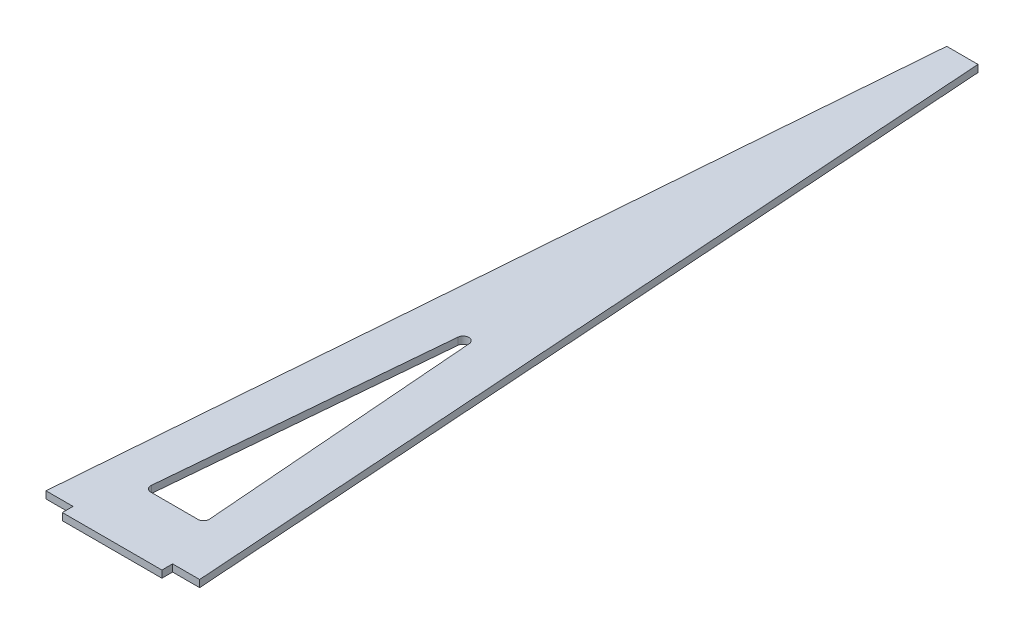
ISO-10303-21;
HEADER;
FILE_DESCRIPTION(('STEP AP214'),'2;1');
FILE_NAME('part.step','',(''),(''),'','','');
FILE_SCHEMA(('AUTOMOTIVE_DESIGN { 1 0 10303 214 1 1 1 1 }'));
ENDSEC;
DATA;
#1=APPLICATION_CONTEXT('core data for automotive mechanical design processes');
#2=APPLICATION_PROTOCOL_DEFINITION('international standard','automotive_design',2000,#1);
#3=PRODUCT_CONTEXT('',#1,'mechanical');
#4=PRODUCT('Part','Part','',(#3));
#5=PRODUCT_RELATED_PRODUCT_CATEGORY('part','',(#4));
#6=PRODUCT_DEFINITION_FORMATION('','',#4);
#7=PRODUCT_DEFINITION_CONTEXT('part definition',#1,'design');
#8=PRODUCT_DEFINITION('design','',#6,#7);
#9=PRODUCT_DEFINITION_SHAPE('','',#8);
#10=(LENGTH_UNIT() NAMED_UNIT(*) SI_UNIT(.MILLI.,.METRE.));
#11=(NAMED_UNIT(*) PLANE_ANGLE_UNIT() SI_UNIT($,.RADIAN.));
#12=(NAMED_UNIT(*) SI_UNIT($,.STERADIAN.) SOLID_ANGLE_UNIT());
#13=UNCERTAINTY_MEASURE_WITH_UNIT(LENGTH_MEASURE(1.E-05),#10,'distance_accuracy_value','');
#14=(GEOMETRIC_REPRESENTATION_CONTEXT(3) GLOBAL_UNCERTAINTY_ASSIGNED_CONTEXT((#13)) GLOBAL_UNIT_ASSIGNED_CONTEXT((#10,
#11,#12)) REPRESENTATION_CONTEXT('',''));
#15=CARTESIAN_POINT('',(0.,0.,0.));
#16=DIRECTION('',(0.,0.,1.));
#17=DIRECTION('',(1.,0.,0.));
#18=AXIS2_PLACEMENT_3D('',#15,#16,#17);
#19=CARTESIAN_POINT('',(0.,3.175,0.));
#20=DIRECTION('',(0.,0.,-1.));
#21=DIRECTION('',(-1.,0.,0.));
#22=AXIS2_PLACEMENT_3D('',#19,#20,#21);
#23=PLANE('',#22);
#24=DIRECTION('',(1.,0.,0.));
#25=VECTOR('',#24,1.);
#26=CARTESIAN_POINT('',(0.,0.,0.));
#27=LINE('',#26,#25);
#28=CARTESIAN_POINT('',(22.225,0.,0.));
#29=VERTEX_POINT('',#28);
#30=CARTESIAN_POINT('',(34.29,0.,0.));
#31=VERTEX_POINT('',#30);
#32=EDGE_CURVE('E169',#29,#31,#27,.T.);
#33=ORIENTED_EDGE('',*,*,#32,.T.);
#34=DIRECTION('',(0.,1.,0.));
#35=VECTOR('',#34,1.);
#36=CARTESIAN_POINT('',(34.29,0.,0.));
#37=LINE('',#36,#35);
#38=CARTESIAN_POINT('',(34.29,3.175,0.));
#39=VERTEX_POINT('',#38);
#40=EDGE_CURVE('E55',#31,#39,#37,.T.);
#41=ORIENTED_EDGE('',*,*,#40,.T.);
#42=DIRECTION('',(1.,0.,0.));
#43=VECTOR('',#42,1.);
#44=CARTESIAN_POINT('',(0.,3.175,0.));
#45=LINE('',#44,#43);
#46=CARTESIAN_POINT('',(22.225,3.175,0.));
#47=VERTEX_POINT('',#46);
#48=EDGE_CURVE('E62',#47,#39,#45,.T.);
#49=ORIENTED_EDGE('',*,*,#48,.F.);
#50=DIRECTION('',(0.,1.,0.));
#51=VECTOR('',#50,1.);
#52=CARTESIAN_POINT('',(22.225,3.175,0.));
#53=LINE('',#52,#51);
#54=EDGE_CURVE('E161',#29,#47,#53,.T.);
#55=ORIENTED_EDGE('',*,*,#54,.F.);
#56=EDGE_LOOP('',(#33,#41,#49,#55));
#57=FACE_BOUND('',#56,.T.);
#58=ADVANCED_FACE('F39',(#57),#23,.F.);
#59=CARTESIAN_POINT('',(-34.29,3.175,0.));
#60=VERTEX_POINT('',#59);
#61=CARTESIAN_POINT('',(-22.225,3.175,0.));
#62=VERTEX_POINT('',#61);
#63=EDGE_CURVE('E159',#60,#62,#45,.T.);
#64=ORIENTED_EDGE('',*,*,#63,.F.);
#65=DIRECTION('',(0.,1.,0.));
#66=VECTOR('',#65,1.);
#67=CARTESIAN_POINT('',(-34.29,0.,0.));
#68=LINE('',#67,#66);
#69=CARTESIAN_POINT('',(-34.29,0.,0.));
#70=VERTEX_POINT('',#69);
#71=EDGE_CURVE('E142',#70,#60,#68,.T.);
#72=ORIENTED_EDGE('',*,*,#71,.F.);
#73=CARTESIAN_POINT('',(-22.225,0.,0.));
#74=VERTEX_POINT('',#73);
#75=EDGE_CURVE('E157',#70,#74,#27,.T.);
#76=ORIENTED_EDGE('',*,*,#75,.T.);
#77=DIRECTION('',(0.,-1.,0.));
#78=VECTOR('',#77,1.);
#79=CARTESIAN_POINT('',(-22.225,3.175,0.));
#80=LINE('',#79,#78);
#81=EDGE_CURVE('E283',#62,#74,#80,.T.);
#82=ORIENTED_EDGE('',*,*,#81,.F.);
#83=EDGE_LOOP('',(#64,#72,#76,#82));
#84=FACE_BOUND('',#83,.T.);
#85=ADVANCED_FACE('F155',(#84),#23,.F.);
#86=CARTESIAN_POINT('',(-5.08,3.175,-372.872));
#87=DIRECTION('',(0.,0.,1.));
#88=DIRECTION('',(1.,0.,0.));
#89=AXIS2_PLACEMENT_3D('',#86,#87,#88);
#90=PLANE('',#89);
#91=DIRECTION('',(-1.,0.,0.));
#92=VECTOR('',#91,1.);
#93=CARTESIAN_POINT('',(-5.08,0.,-372.872));
#94=LINE('',#93,#92);
#95=CARTESIAN_POINT('',(8.89,0.,-372.872));
#96=VERTEX_POINT('',#95);
#97=CARTESIAN_POINT('',(-5.08,0.,-372.872));
#98=VERTEX_POINT('',#97);
#99=EDGE_CURVE('E175',#96,#98,#94,.T.);
#100=ORIENTED_EDGE('',*,*,#99,.T.);
#101=DIRECTION('',(0.,-1.,0.));
#102=VECTOR('',#101,1.);
#103=CARTESIAN_POINT('',(-5.08,3.175,-372.872));
#104=LINE('',#103,#102);
#105=CARTESIAN_POINT('',(-5.08,3.175,-372.872));
#106=VERTEX_POINT('',#105);
#107=EDGE_CURVE('E145',#106,#98,#104,.T.);
#108=ORIENTED_EDGE('',*,*,#107,.F.);
#109=DIRECTION('',(-1.,0.,0.));
#110=VECTOR('',#109,1.);
#111=CARTESIAN_POINT('',(8.89,3.175,-372.872));
#112=LINE('',#111,#110);
#113=CARTESIAN_POINT('',(8.89,3.175,-372.872));
#114=VERTEX_POINT('',#113);
#115=EDGE_CURVE('E182',#114,#106,#112,.T.);
#116=ORIENTED_EDGE('',*,*,#115,.F.);
#117=DIRECTION('',(0.,-1.,0.));
#118=VECTOR('',#117,1.);
#119=CARTESIAN_POINT('',(8.89,3.175,-372.872));
#120=LINE('',#119,#118);
#121=EDGE_CURVE('E181',#114,#96,#120,.T.);
#122=ORIENTED_EDGE('',*,*,#121,.T.);
#123=EDGE_LOOP('',(#100,#108,#116,#122));
#124=FACE_BOUND('',#123,.T.);
#125=ADVANCED_FACE('F271',(#124),#90,.F.);
#126=CARTESIAN_POINT('',(0.,3.175,0.));
#127=DIRECTION('',(0.,1.,0.));
#128=DIRECTION('',(0.,0.,1.));
#129=AXIS2_PLACEMENT_3D('',#126,#127,#128);
#130=PLANE('',#129);
#131=DIRECTION('',(0.0780986025557039,0.,-0.996945639580637));
#132=VECTOR('',#131,1.);
#133=CARTESIAN_POINT('',(-5.08,3.175,-372.872));
#134=LINE('',#133,#132);
#135=EDGE_CURVE('E151',#60,#106,#134,.T.);
#136=ORIENTED_EDGE('',*,*,#135,.F.);
#137=ORIENTED_EDGE('',*,*,#63,.T.);
#138=DIRECTION('',(0.,0.,-1.));
#139=VECTOR('',#138,1.);
#140=CARTESIAN_POINT('',(-22.225,3.175,4.7625));
#141=LINE('',#140,#139);
#142=CARTESIAN_POINT('',(-22.225,3.175,4.7625));
#143=VERTEX_POINT('',#142);
#144=EDGE_CURVE('E297',#143,#62,#141,.T.);
#145=ORIENTED_EDGE('',*,*,#144,.F.);
#146=DIRECTION('',(-1.,0.,0.));
#147=VECTOR('',#146,1.);
#148=CARTESIAN_POINT('',(-22.225,3.175,4.7625));
#149=LINE('',#148,#147);
#150=CARTESIAN_POINT('',(22.225,3.175,4.7625));
#151=VERTEX_POINT('',#150);
#152=EDGE_CURVE('E302',#151,#143,#149,.T.);
#153=ORIENTED_EDGE('',*,*,#152,.F.);
#154=DIRECTION('',(0.,0.,-1.));
#155=VECTOR('',#154,1.);
#156=CARTESIAN_POINT('',(22.225,3.175,4.7625));
#157=LINE('',#156,#155);
#158=EDGE_CURVE('E236',#151,#47,#157,.T.);
#159=ORIENTED_EDGE('',*,*,#158,.T.);
#160=ORIENTED_EDGE('',*,*,#48,.T.);
#161=DIRECTION('',(0.0679623899072531,0.,0.997687883838475));
#162=VECTOR('',#161,1.);
#163=CARTESIAN_POINT('',(8.89,3.175,-372.872));
#164=LINE('',#163,#162);
#165=EDGE_CURVE('E269',#114,#39,#164,.T.);
#166=ORIENTED_EDGE('',*,*,#165,.F.);
#167=ORIENTED_EDGE('',*,*,#115,.T.);
#168=EDGE_LOOP('',(#136,#137,#145,#153,#159,#160,#166,#167));
#169=FACE_BOUND('',#168,.T.);
#170=DIRECTION('',(-0.0882106536253891,0.,0.996101842477455));
#171=VECTOR('',#170,1.);
#172=CARTESIAN_POINT('',(0.937890665041487,3.175,-181.675502439183));
#173=LINE('',#172,#171);
#174=CARTESIAN_POINT('',(-1.74718161442714,3.175,-151.354840083338));
#175=VERTEX_POINT('',#174);
#176=CARTESIAN_POINT('',(-12.8813791982194,3.175,-25.6240550602085));
#177=VERTEX_POINT('',#176);
#178=EDGE_CURVE('E224',#175,#177,#173,.T.);
#179=ORIENTED_EDGE('',*,*,#178,.F.);
#180=CARTESIAN_POINT('',(0.782917065465601,3.175,-151.130785023129));
#181=DIRECTION('',(0.,1.,0.));
#182=DIRECTION('',(0.,0.,1.));
#183=AXIS2_PLACEMENT_3D('',#180,#181,#182);
#184=CIRCLE('',#183,2.54);
#185=CARTESIAN_POINT('',(3.31515899000042,3.175,-151.329155473621));
#186=VERTEX_POINT('',#185);
#187=EDGE_CURVE('E207',#175,#186,#184,.F.);
#188=ORIENTED_EDGE('',*,*,#187,.T.);
#189=DIRECTION('',(-0.0780986025557052,0.,-0.996945639580637));
#190=VECTOR('',#189,1.);
#191=CARTESIAN_POINT('',(13.3791595890922,3.175,-22.86));
#192=LINE('',#191,#190);
#193=CARTESIAN_POINT('',(13.1646414679705,3.175,-25.5983704504915));
#194=VERTEX_POINT('',#193);
#195=EDGE_CURVE('E255',#194,#186,#192,.T.);
#196=ORIENTED_EDGE('',*,*,#195,.F.);
#197=CARTESIAN_POINT('',(10.6323995434357,3.175,-25.4));
#198=DIRECTION('',(0.,1.,0.));
#199=DIRECTION('',(0.,0.,1.));
#200=AXIS2_PLACEMENT_3D('',#197,#198,#199);
#201=CIRCLE('',#200,2.54);
#202=CARTESIAN_POINT('',(10.6323995434357,3.175,-22.86));
#203=VERTEX_POINT('',#202);
#204=EDGE_CURVE('E213',#194,#203,#201,.F.);
#205=ORIENTED_EDGE('',*,*,#204,.T.);
#206=DIRECTION('',(1.,0.,0.));
#207=VECTOR('',#206,1.);
#208=CARTESIAN_POINT('',(-13.126152466494,3.175,-22.86));
#209=LINE('',#208,#207);
#210=CARTESIAN_POINT('',(-10.3512805183267,3.175,-22.86));
#211=VERTEX_POINT('',#210);
#212=EDGE_CURVE('E226',#211,#203,#209,.T.);
#213=ORIENTED_EDGE('',*,*,#212,.F.);
#214=CARTESIAN_POINT('',(-10.3512805183267,3.175,-25.4));
#215=DIRECTION('',(0.,1.,0.));
#216=DIRECTION('',(0.,0.,1.));
#217=AXIS2_PLACEMENT_3D('',#214,#215,#216);
#218=CIRCLE('',#217,2.54);
#219=EDGE_CURVE('E48',#211,#177,#218,.F.);
#220=ORIENTED_EDGE('',*,*,#219,.T.);
#221=EDGE_LOOP('',(#179,#188,#196,#205,#213,#220));
#222=FACE_BOUND('',#221,.T.);
#223=ADVANCED_FACE('F223',(#169,#222),#130,.T.);
#224=CARTESIAN_POINT('',(0.,0.,0.));
#225=DIRECTION('',(0.,1.,0.));
#226=DIRECTION('',(0.,0.,1.));
#227=AXIS2_PLACEMENT_3D('',#224,#225,#226);
#228=PLANE('',#227);
#229=DIRECTION('',(1.,0.,0.));
#230=VECTOR('',#229,1.);
#231=CARTESIAN_POINT('',(-13.126152466494,0.,-22.86));
#232=LINE('',#231,#230);
#233=CARTESIAN_POINT('',(-10.3512805183267,0.,-22.86));
#234=VERTEX_POINT('',#233);
#235=CARTESIAN_POINT('',(10.6323995434357,0.,-22.86));
#236=VERTEX_POINT('',#235);
#237=EDGE_CURVE('E242',#234,#236,#232,.T.);
#238=ORIENTED_EDGE('',*,*,#237,.T.);
#239=CARTESIAN_POINT('',(10.6323995434357,0.,-25.4));
#240=DIRECTION('',(0.,1.,0.));
#241=DIRECTION('',(0.,0.,1.));
#242=AXIS2_PLACEMENT_3D('',#239,#240,#241);
#243=CIRCLE('',#242,2.54);
#244=CARTESIAN_POINT('',(13.1646414679705,0.,-25.5983704504915));
#245=VERTEX_POINT('',#244);
#246=EDGE_CURVE('E216',#236,#245,#243,.T.);
#247=ORIENTED_EDGE('',*,*,#246,.T.);
#248=DIRECTION('',(-0.0780986025557052,0.,-0.996945639580637));
#249=VECTOR('',#248,1.);
#250=CARTESIAN_POINT('',(13.3791595890922,0.,-22.86));
#251=LINE('',#250,#249);
#252=CARTESIAN_POINT('',(3.31515899000042,0.,-151.329155473621));
#253=VERTEX_POINT('',#252);
#254=EDGE_CURVE('E249',#245,#253,#251,.T.);
#255=ORIENTED_EDGE('',*,*,#254,.T.);
#256=CARTESIAN_POINT('',(0.782917065465601,0.,-151.130785023129));
#257=DIRECTION('',(0.,1.,0.));
#258=DIRECTION('',(0.,0.,1.));
#259=AXIS2_PLACEMENT_3D('',#256,#257,#258);
#260=CIRCLE('',#259,2.54);
#261=CARTESIAN_POINT('',(-1.74718161442714,0.,-151.354840083338));
#262=VERTEX_POINT('',#261);
#263=EDGE_CURVE('E210',#253,#262,#260,.T.);
#264=ORIENTED_EDGE('',*,*,#263,.T.);
#265=DIRECTION('',(-0.0882106536253891,0.,0.996101842477455));
#266=VECTOR('',#265,1.);
#267=CARTESIAN_POINT('',(0.937890665041487,0.,-181.675502439183));
#268=LINE('',#267,#266);
#269=CARTESIAN_POINT('',(-12.8813791982194,0.,-25.6240550602085));
#270=VERTEX_POINT('',#269);
#271=EDGE_CURVE('E244',#262,#270,#268,.T.);
#272=ORIENTED_EDGE('',*,*,#271,.T.);
#273=CARTESIAN_POINT('',(-10.3512805183267,0.,-25.4));
#274=DIRECTION('',(0.,1.,0.));
#275=DIRECTION('',(0.,0.,1.));
#276=AXIS2_PLACEMENT_3D('',#273,#274,#275);
#277=CIRCLE('',#276,2.54);
#278=EDGE_CURVE('E11',#270,#234,#277,.T.);
#279=ORIENTED_EDGE('',*,*,#278,.T.);
#280=EDGE_LOOP('',(#238,#247,#255,#264,#272,#279));
#281=FACE_BOUND('',#280,.T.);
#282=ORIENTED_EDGE('',*,*,#75,.F.);
#283=DIRECTION('',(0.0780986025557039,0.,-0.996945639580637));
#284=VECTOR('',#283,1.);
#285=CARTESIAN_POINT('',(-5.08,0.,-372.872));
#286=LINE('',#285,#284);
#287=EDGE_CURVE('E139',#70,#98,#286,.T.);
#288=ORIENTED_EDGE('',*,*,#287,.T.);
#289=ORIENTED_EDGE('',*,*,#99,.F.);
#290=DIRECTION('',(0.0679623899072531,0.,0.997687883838475));
#291=VECTOR('',#290,1.);
#292=CARTESIAN_POINT('',(8.89,0.,-372.872));
#293=LINE('',#292,#291);
#294=EDGE_CURVE('E274',#96,#31,#293,.T.);
#295=ORIENTED_EDGE('',*,*,#294,.T.);
#296=ORIENTED_EDGE('',*,*,#32,.F.);
#297=DIRECTION('',(0.,0.,-1.));
#298=VECTOR('',#297,1.);
#299=CARTESIAN_POINT('',(22.225,0.,4.7625));
#300=LINE('',#299,#298);
#301=CARTESIAN_POINT('',(22.225,0.,4.7625));
#302=VERTEX_POINT('',#301);
#303=EDGE_CURVE('E292',#302,#29,#300,.T.);
#304=ORIENTED_EDGE('',*,*,#303,.F.);
#305=DIRECTION('',(1.,0.,0.));
#306=VECTOR('',#305,1.);
#307=CARTESIAN_POINT('',(-22.225,0.,4.7625));
#308=LINE('',#307,#306);
#309=CARTESIAN_POINT('',(-22.225,0.,4.7625));
#310=VERTEX_POINT('',#309);
#311=EDGE_CURVE('E289',#310,#302,#308,.T.);
#312=ORIENTED_EDGE('',*,*,#311,.F.);
#313=DIRECTION('',(0.,0.,-1.));
#314=VECTOR('',#313,1.);
#315=CARTESIAN_POINT('',(-22.225,0.,4.7625));
#316=LINE('',#315,#314);
#317=EDGE_CURVE('E167',#310,#74,#316,.T.);
#318=ORIENTED_EDGE('',*,*,#317,.T.);
#319=EDGE_LOOP('',(#282,#288,#289,#295,#296,#304,#312,#318));
#320=FACE_BOUND('',#319,.T.);
#321=ADVANCED_FACE('F164',(#281,#320),#228,.F.);
#322=CARTESIAN_POINT('',(0.937890665041487,0.,-181.675502439183));
#323=DIRECTION('',(-0.996101842477455,0.,-0.0882106536253891));
#324=DIRECTION('',(-0.0882106536253891,0.,0.996101842477456));
#325=AXIS2_PLACEMENT_3D('',#322,#323,#324);
#326=PLANE('',#325);
#327=ORIENTED_EDGE('',*,*,#271,.F.);
#328=DIRECTION('',(0.,1.,0.));
#329=VECTOR('',#328,1.);
#330=CARTESIAN_POINT('',(-1.74718161442713,3.175,-151.354840083338));
#331=LINE('',#330,#329);
#332=EDGE_CURVE('E189',#262,#175,#331,.T.);
#333=ORIENTED_EDGE('',*,*,#332,.T.);
#334=ORIENTED_EDGE('',*,*,#178,.T.);
#335=DIRECTION('',(0.,1.,0.));
#336=VECTOR('',#335,1.);
#337=CARTESIAN_POINT('',(-12.8813791982194,0.,-25.6240550602085));
#338=LINE('',#337,#336);
#339=EDGE_CURVE('E186',#177,#270,#338,.F.);
#340=ORIENTED_EDGE('',*,*,#339,.T.);
#341=EDGE_LOOP('',(#327,#333,#334,#340));
#342=FACE_BOUND('',#341,.T.);
#343=ADVANCED_FACE('F232',(#342),#326,.F.);
#344=CARTESIAN_POINT('',(13.3791595890922,0.,-22.86));
#345=DIRECTION('',(0.996945639580637,0.,-0.0780986025557052));
#346=DIRECTION('',(-0.0780986025557052,0.,-0.996945639580637));
#347=AXIS2_PLACEMENT_3D('',#344,#345,#346);
#348=PLANE('',#347);
#349=ORIENTED_EDGE('',*,*,#195,.T.);
#350=DIRECTION('',(0.,1.,0.));
#351=VECTOR('',#350,1.);
#352=CARTESIAN_POINT('',(3.31515899000042,0.,-151.329155473621));
#353=LINE('',#352,#351);
#354=EDGE_CURVE('E197',#186,#253,#353,.F.);
#355=ORIENTED_EDGE('',*,*,#354,.T.);
#356=ORIENTED_EDGE('',*,*,#254,.F.);
#357=DIRECTION('',(0.,1.,0.));
#358=VECTOR('',#357,1.);
#359=CARTESIAN_POINT('',(13.1646414679705,3.175,-25.5983704504915));
#360=LINE('',#359,#358);
#361=EDGE_CURVE('E193',#245,#194,#360,.T.);
#362=ORIENTED_EDGE('',*,*,#361,.T.);
#363=EDGE_LOOP('',(#349,#355,#356,#362));
#364=FACE_BOUND('',#363,.T.);
#365=ADVANCED_FACE('F352',(#364),#348,.F.);
#366=CARTESIAN_POINT('',(-13.126152466494,0.,-22.86));
#367=DIRECTION('',(0.,0.,1.));
#368=DIRECTION('',(1.,0.,0.));
#369=AXIS2_PLACEMENT_3D('',#366,#367,#368);
#370=PLANE('',#369);
#371=ORIENTED_EDGE('',*,*,#212,.T.);
#372=DIRECTION('',(0.,1.,0.));
#373=VECTOR('',#372,1.);
#374=CARTESIAN_POINT('',(10.6323995434357,0.,-22.86));
#375=LINE('',#374,#373);
#376=EDGE_CURVE('E204',#203,#236,#375,.F.);
#377=ORIENTED_EDGE('',*,*,#376,.T.);
#378=ORIENTED_EDGE('',*,*,#237,.F.);
#379=DIRECTION('',(0.,1.,0.));
#380=VECTOR('',#379,1.);
#381=CARTESIAN_POINT('',(-10.3512805183267,3.175,-22.86));
#382=LINE('',#381,#380);
#383=EDGE_CURVE('E200',#234,#211,#382,.T.);
#384=ORIENTED_EDGE('',*,*,#383,.T.);
#385=EDGE_LOOP('',(#371,#377,#378,#384));
#386=FACE_BOUND('',#385,.T.);
#387=ADVANCED_FACE('F246',(#386),#370,.F.);
#388=CARTESIAN_POINT('',(0.782917065465601,0.,-151.130785023129));
#389=DIRECTION('',(0.,-1.,0.));
#390=DIRECTION('',(0.,0.,-1.));
#391=AXIS2_PLACEMENT_3D('',#388,#389,#390);
#392=CYLINDRICAL_SURFACE('',#391,2.54);
#393=ORIENTED_EDGE('',*,*,#263,.F.);
#394=ORIENTED_EDGE('',*,*,#354,.F.);
#395=ORIENTED_EDGE('',*,*,#187,.F.);
#396=ORIENTED_EDGE('',*,*,#332,.F.);
#397=EDGE_LOOP('',(#393,#394,#395,#396));
#398=FACE_BOUND('',#397,.T.);
#399=ADVANCED_FACE('F339',(#398),#392,.F.);
#400=CARTESIAN_POINT('',(10.6323995434357,0.,-25.4));
#401=DIRECTION('',(0.,-1.,0.));
#402=DIRECTION('',(0.,0.,-1.));
#403=AXIS2_PLACEMENT_3D('',#400,#401,#402);
#404=CYLINDRICAL_SURFACE('',#403,2.54);
#405=ORIENTED_EDGE('',*,*,#246,.F.);
#406=ORIENTED_EDGE('',*,*,#376,.F.);
#407=ORIENTED_EDGE('',*,*,#204,.F.);
#408=ORIENTED_EDGE('',*,*,#361,.F.);
#409=EDGE_LOOP('',(#405,#406,#407,#408));
#410=FACE_BOUND('',#409,.T.);
#411=ADVANCED_FACE('F341',(#410),#404,.F.);
#412=CARTESIAN_POINT('',(-10.3512805183267,0.,-25.4));
#413=DIRECTION('',(0.,-1.,0.));
#414=DIRECTION('',(0.,0.,-1.));
#415=AXIS2_PLACEMENT_3D('',#412,#413,#414);
#416=CYLINDRICAL_SURFACE('',#415,2.54);
#417=ORIENTED_EDGE('',*,*,#278,.F.);
#418=ORIENTED_EDGE('',*,*,#339,.F.);
#419=ORIENTED_EDGE('',*,*,#219,.F.);
#420=ORIENTED_EDGE('',*,*,#383,.F.);
#421=EDGE_LOOP('',(#417,#418,#419,#420));
#422=FACE_BOUND('',#421,.T.);
#423=ADVANCED_FACE('F41',(#422),#416,.F.);
#424=CARTESIAN_POINT('',(22.225,3.175,4.7625));
#425=DIRECTION('',(-1.,0.,0.));
#426=DIRECTION('',(0.,0.,1.));
#427=AXIS2_PLACEMENT_3D('',#424,#425,#426);
#428=PLANE('',#427);
#429=ORIENTED_EDGE('',*,*,#54,.T.);
#430=ORIENTED_EDGE('',*,*,#158,.F.);
#431=DIRECTION('',(0.,1.,0.));
#432=VECTOR('',#431,1.);
#433=CARTESIAN_POINT('',(22.225,3.175,4.7625));
#434=LINE('',#433,#432);
#435=EDGE_CURVE('E286',#302,#151,#434,.T.);
#436=ORIENTED_EDGE('',*,*,#435,.F.);
#437=ORIENTED_EDGE('',*,*,#303,.T.);
#438=EDGE_LOOP('',(#429,#430,#436,#437));
#439=FACE_BOUND('',#438,.T.);
#440=ADVANCED_FACE('F305',(#439),#428,.F.);
#441=CARTESIAN_POINT('',(-22.225,3.175,4.7625));
#442=DIRECTION('',(1.,0.,0.));
#443=DIRECTION('',(0.,0.,-1.));
#444=AXIS2_PLACEMENT_3D('',#441,#442,#443);
#445=PLANE('',#444);
#446=ORIENTED_EDGE('',*,*,#81,.T.);
#447=ORIENTED_EDGE('',*,*,#317,.F.);
#448=DIRECTION('',(0.,-1.,0.));
#449=VECTOR('',#448,1.);
#450=CARTESIAN_POINT('',(-22.225,3.175,4.7625));
#451=LINE('',#450,#449);
#452=EDGE_CURVE('E310',#143,#310,#451,.T.);
#453=ORIENTED_EDGE('',*,*,#452,.F.);
#454=ORIENTED_EDGE('',*,*,#144,.T.);
#455=EDGE_LOOP('',(#446,#447,#453,#454));
#456=FACE_BOUND('',#455,.T.);
#457=ADVANCED_FACE('F320',(#456),#445,.F.);
#458=CARTESIAN_POINT('',(0.,0.,4.7625));
#459=DIRECTION('',(0.,0.,1.));
#460=DIRECTION('',(1.,0.,0.));
#461=AXIS2_PLACEMENT_3D('',#458,#459,#460);
#462=PLANE('',#461);
#463=ORIENTED_EDGE('',*,*,#435,.T.);
#464=ORIENTED_EDGE('',*,*,#152,.T.);
#465=ORIENTED_EDGE('',*,*,#452,.T.);
#466=ORIENTED_EDGE('',*,*,#311,.T.);
#467=EDGE_LOOP('',(#463,#464,#465,#466));
#468=FACE_BOUND('',#467,.T.);
#469=ADVANCED_FACE('F317',(#468),#462,.T.);
#470=CARTESIAN_POINT('',(8.89,0.,-372.872));
#471=DIRECTION('',(-0.997687883838475,0.,0.0679623899072531));
#472=DIRECTION('',(0.0679623899072531,0.,0.997687883838475));
#473=AXIS2_PLACEMENT_3D('',#470,#471,#472);
#474=PLANE('',#473);
#475=ORIENTED_EDGE('',*,*,#165,.T.);
#476=ORIENTED_EDGE('',*,*,#40,.F.);
#477=ORIENTED_EDGE('',*,*,#294,.F.);
#478=ORIENTED_EDGE('',*,*,#121,.F.);
#479=EDGE_LOOP('',(#475,#476,#477,#478));
#480=FACE_BOUND('',#479,.T.);
#481=ADVANCED_FACE('F319',(#480),#474,.F.);
#482=CARTESIAN_POINT('',(-5.08,0.,-372.872));
#483=DIRECTION('',(0.996945639580637,0.,0.0780986025557039));
#484=DIRECTION('',(0.0780986025557039,0.,-0.996945639580637));
#485=AXIS2_PLACEMENT_3D('',#482,#483,#484);
#486=PLANE('',#485);
#487=ORIENTED_EDGE('',*,*,#135,.T.);
#488=ORIENTED_EDGE('',*,*,#107,.T.);
#489=ORIENTED_EDGE('',*,*,#287,.F.);
#490=ORIENTED_EDGE('',*,*,#71,.T.);
#491=EDGE_LOOP('',(#487,#488,#489,#490));
#492=FACE_BOUND('',#491,.T.);
#493=ADVANCED_FACE('F141',(#492),#486,.F.);
#494=CLOSED_SHELL('',(#58,#85,#125,#223,#321,#343,#365,#387,#399,#411,#423,#440,#457,#469,#481,#493));
#495=MANIFOLD_SOLID_BREP('B2',#494);
#496=ADVANCED_BREP_SHAPE_REPRESENTATION('',(#18,#495),#14);
#497=SHAPE_DEFINITION_REPRESENTATION(#9,#496);
ENDSEC;
END-ISO-10303-21;
